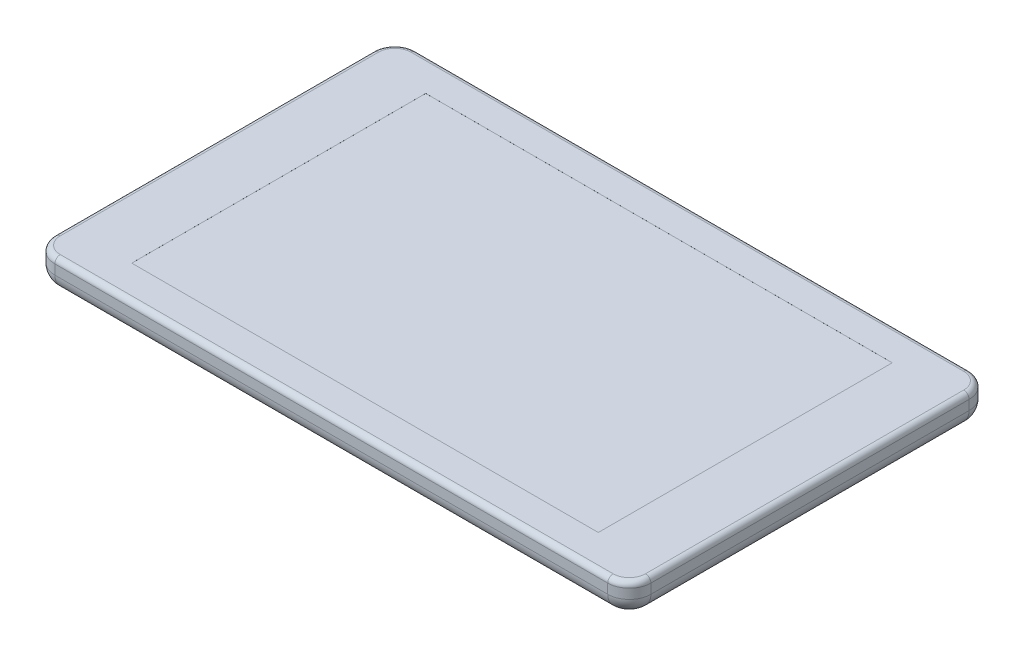
ISO-10303-21;
HEADER;
FILE_DESCRIPTION(('STEP AP214'),'2;1');
FILE_NAME('part.step','',(''),(''),'','','');
FILE_SCHEMA(('AUTOMOTIVE_DESIGN { 1 0 10303 214 1 1 1 1 }'));
ENDSEC;
DATA;
#1=APPLICATION_CONTEXT('core data for automotive mechanical design processes');
#2=APPLICATION_PROTOCOL_DEFINITION('international standard','automotive_design',2000,#1);
#3=PRODUCT_CONTEXT('',#1,'mechanical');
#4=PRODUCT('Part','Part','',(#3));
#5=PRODUCT_RELATED_PRODUCT_CATEGORY('part','',(#4));
#6=PRODUCT_DEFINITION_FORMATION('','',#4);
#7=PRODUCT_DEFINITION_CONTEXT('part definition',#1,'design');
#8=PRODUCT_DEFINITION('design','',#6,#7);
#9=PRODUCT_DEFINITION_SHAPE('','',#8);
#10=(LENGTH_UNIT() NAMED_UNIT(*) SI_UNIT(.MILLI.,.METRE.));
#11=(NAMED_UNIT(*) PLANE_ANGLE_UNIT() SI_UNIT($,.RADIAN.));
#12=(NAMED_UNIT(*) SI_UNIT($,.STERADIAN.) SOLID_ANGLE_UNIT());
#13=UNCERTAINTY_MEASURE_WITH_UNIT(LENGTH_MEASURE(1.E-05),#10,'distance_accuracy_value','');
#14=(GEOMETRIC_REPRESENTATION_CONTEXT(3) GLOBAL_UNCERTAINTY_ASSIGNED_CONTEXT((#13)) GLOBAL_UNIT_ASSIGNED_CONTEXT((#10,
#11,#12)) REPRESENTATION_CONTEXT('',''));
#15=CARTESIAN_POINT('',(0.,0.,0.));
#16=DIRECTION('',(0.,0.,1.));
#17=DIRECTION('',(1.,0.,0.));
#18=AXIS2_PLACEMENT_3D('',#15,#16,#17);
#19=CARTESIAN_POINT('',(-110.5,11.6,67.));
#20=DIRECTION('',(1.,0.,0.));
#21=DIRECTION('',(0.,0.,-1.));
#22=AXIS2_PLACEMENT_3D('',#19,#20,#21);
#23=PLANE('',#22);
#24=DIRECTION('',(0.,-1.,0.));
#25=VECTOR('',#24,1.);
#26=CARTESIAN_POINT('',(-110.5,11.6,-59.));
#27=LINE('',#26,#25);
#28=CARTESIAN_POINT('',(-110.5,9.6,-59.));
#29=VERTEX_POINT('',#28);
#30=CARTESIAN_POINT('',(-110.5,6.,-59.));
#31=VERTEX_POINT('',#30);
#32=EDGE_CURVE('E216',#29,#31,#27,.T.);
#33=ORIENTED_EDGE('',*,*,#32,.T.);
#34=DIRECTION('',(0.,0.,1.));
#35=VECTOR('',#34,1.);
#36=CARTESIAN_POINT('',(-110.5,6.,67.));
#37=LINE('',#36,#35);
#38=CARTESIAN_POINT('',(-110.5,6.,59.));
#39=VERTEX_POINT('',#38);
#40=EDGE_CURVE('E12',#31,#39,#37,.T.);
#41=ORIENTED_EDGE('',*,*,#40,.T.);
#42=DIRECTION('',(0.,-1.,0.));
#43=VECTOR('',#42,1.);
#44=CARTESIAN_POINT('',(-110.5,11.6,59.));
#45=LINE('',#44,#43);
#46=CARTESIAN_POINT('',(-110.5,9.6,59.));
#47=VERTEX_POINT('',#46);
#48=EDGE_CURVE('E214',#39,#47,#45,.F.);
#49=ORIENTED_EDGE('',*,*,#48,.T.);
#50=DIRECTION('',(0.,0.,1.));
#51=VECTOR('',#50,1.);
#52=CARTESIAN_POINT('',(-110.5,9.6,-59.));
#53=LINE('',#52,#51);
#54=EDGE_CURVE('E264',#47,#29,#53,.F.);
#55=ORIENTED_EDGE('',*,*,#54,.T.);
#56=EDGE_LOOP('',(#33,#41,#49,#55));
#57=FACE_BOUND('',#56,.T.);
#58=ADVANCED_FACE('F36',(#57),#23,.F.);
#59=CARTESIAN_POINT('',(110.5,11.6,67.));
#60=DIRECTION('',(0.,0.,-1.));
#61=DIRECTION('',(-1.,0.,0.));
#62=AXIS2_PLACEMENT_3D('',#59,#60,#61);
#63=PLANE('',#62);
#64=DIRECTION('',(0.,-1.,0.));
#65=VECTOR('',#64,1.);
#66=CARTESIAN_POINT('',(-102.5,11.6,67.));
#67=LINE('',#66,#65);
#68=CARTESIAN_POINT('',(-102.5,9.6,67.));
#69=VERTEX_POINT('',#68);
#70=CARTESIAN_POINT('',(-102.5,6.,67.));
#71=VERTEX_POINT('',#70);
#72=EDGE_CURVE('E229',#69,#71,#67,.T.);
#73=ORIENTED_EDGE('',*,*,#72,.T.);
#74=DIRECTION('',(1.,0.,0.));
#75=VECTOR('',#74,1.);
#76=CARTESIAN_POINT('',(110.5,6.,67.));
#77=LINE('',#76,#75);
#78=CARTESIAN_POINT('',(102.5,6.,67.));
#79=VERTEX_POINT('',#78);
#80=EDGE_CURVE('E313',#71,#79,#77,.T.);
#81=ORIENTED_EDGE('',*,*,#80,.T.);
#82=DIRECTION('',(0.,-1.,0.));
#83=VECTOR('',#82,1.);
#84=CARTESIAN_POINT('',(102.5,11.6,67.));
#85=LINE('',#84,#83);
#86=CARTESIAN_POINT('',(102.5,9.6,67.));
#87=VERTEX_POINT('',#86);
#88=EDGE_CURVE('E232',#79,#87,#85,.F.);
#89=ORIENTED_EDGE('',*,*,#88,.T.);
#90=DIRECTION('',(1.,0.,0.));
#91=VECTOR('',#90,1.);
#92=CARTESIAN_POINT('',(-102.5,9.6,67.));
#93=LINE('',#92,#91);
#94=EDGE_CURVE('E259',#87,#69,#93,.F.);
#95=ORIENTED_EDGE('',*,*,#94,.T.);
#96=EDGE_LOOP('',(#73,#81,#89,#95));
#97=FACE_BOUND('',#96,.T.);
#98=ADVANCED_FACE('F395',(#97),#63,.F.);
#99=CARTESIAN_POINT('',(110.5,11.6,67.));
#100=DIRECTION('',(-1.,0.,0.));
#101=DIRECTION('',(0.,0.,1.));
#102=AXIS2_PLACEMENT_3D('',#99,#100,#101);
#103=PLANE('',#102);
#104=DIRECTION('',(0.,-1.,0.));
#105=VECTOR('',#104,1.);
#106=CARTESIAN_POINT('',(110.5,11.6,59.));
#107=LINE('',#106,#105);
#108=CARTESIAN_POINT('',(110.5,9.6,59.));
#109=VERTEX_POINT('',#108);
#110=CARTESIAN_POINT('',(110.5,6.,59.));
#111=VERTEX_POINT('',#110);
#112=EDGE_CURVE('E224',#109,#111,#107,.T.);
#113=ORIENTED_EDGE('',*,*,#112,.T.);
#114=DIRECTION('',(0.,0.,-1.));
#115=VECTOR('',#114,1.);
#116=CARTESIAN_POINT('',(110.5,6.,67.));
#117=LINE('',#116,#115);
#118=CARTESIAN_POINT('',(110.5,6.,-59.));
#119=VERTEX_POINT('',#118);
#120=EDGE_CURVE('E317',#111,#119,#117,.T.);
#121=ORIENTED_EDGE('',*,*,#120,.T.);
#122=DIRECTION('',(0.,-1.,0.));
#123=VECTOR('',#122,1.);
#124=CARTESIAN_POINT('',(110.5,11.6,-59.));
#125=LINE('',#124,#123);
#126=CARTESIAN_POINT('',(110.5,9.6,-59.));
#127=VERTEX_POINT('',#126);
#128=EDGE_CURVE('E227',#119,#127,#125,.F.);
#129=ORIENTED_EDGE('',*,*,#128,.T.);
#130=DIRECTION('',(0.,0.,-1.));
#131=VECTOR('',#130,1.);
#132=CARTESIAN_POINT('',(110.5,9.6,59.));
#133=LINE('',#132,#131);
#134=EDGE_CURVE('E254',#127,#109,#133,.F.);
#135=ORIENTED_EDGE('',*,*,#134,.T.);
#136=EDGE_LOOP('',(#113,#121,#129,#135));
#137=FACE_BOUND('',#136,.T.);
#138=ADVANCED_FACE('F378',(#137),#103,.F.);
#139=CARTESIAN_POINT('',(110.5,11.6,-67.));
#140=DIRECTION('',(0.,0.,1.));
#141=DIRECTION('',(1.,0.,0.));
#142=AXIS2_PLACEMENT_3D('',#139,#140,#141);
#143=PLANE('',#142);
#144=DIRECTION('',(0.,-1.,0.));
#145=VECTOR('',#144,1.);
#146=CARTESIAN_POINT('',(102.5,11.6,-67.));
#147=LINE('',#146,#145);
#148=CARTESIAN_POINT('',(102.5,9.6,-67.));
#149=VERTEX_POINT('',#148);
#150=CARTESIAN_POINT('',(102.5,6.,-67.));
#151=VERTEX_POINT('',#150);
#152=EDGE_CURVE('E219',#149,#151,#147,.T.);
#153=ORIENTED_EDGE('',*,*,#152,.T.);
#154=DIRECTION('',(-1.,0.,0.));
#155=VECTOR('',#154,1.);
#156=CARTESIAN_POINT('',(110.5,6.,-67.));
#157=LINE('',#156,#155);
#158=CARTESIAN_POINT('',(-102.5,6.,-67.));
#159=VERTEX_POINT('',#158);
#160=EDGE_CURVE('E321',#151,#159,#157,.T.);
#161=ORIENTED_EDGE('',*,*,#160,.T.);
#162=DIRECTION('',(0.,-1.,0.));
#163=VECTOR('',#162,1.);
#164=CARTESIAN_POINT('',(-102.5,11.6,-67.));
#165=LINE('',#164,#163);
#166=CARTESIAN_POINT('',(-102.5,9.6,-67.));
#167=VERTEX_POINT('',#166);
#168=EDGE_CURVE('E222',#159,#167,#165,.F.);
#169=ORIENTED_EDGE('',*,*,#168,.T.);
#170=DIRECTION('',(-1.,0.,0.));
#171=VECTOR('',#170,1.);
#172=CARTESIAN_POINT('',(102.5,9.6,-67.));
#173=LINE('',#172,#171);
#174=EDGE_CURVE('E269',#167,#149,#173,.F.);
#175=ORIENTED_EDGE('',*,*,#174,.T.);
#176=EDGE_LOOP('',(#153,#161,#169,#175));
#177=FACE_BOUND('',#176,.T.);
#178=ADVANCED_FACE('F360',(#177),#143,.F.);
#179=CARTESIAN_POINT('',(0.,11.6,0.));
#180=DIRECTION('',(0.,1.,0.));
#181=DIRECTION('',(0.,0.,1.));
#182=AXIS2_PLACEMENT_3D('',#179,#180,#181);
#183=PLANE('',#182);
#184=DIRECTION('',(0.,0.,1.));
#185=VECTOR('',#184,1.);
#186=CARTESIAN_POINT('',(-86.5,11.6,54.5));
#187=LINE('',#186,#185);
#188=CARTESIAN_POINT('',(-86.5,11.6,-54.5));
#189=VERTEX_POINT('',#188);
#190=CARTESIAN_POINT('',(-86.5,11.6,54.5));
#191=VERTEX_POINT('',#190);
#192=EDGE_CURVE('E53',#189,#191,#187,.T.);
#193=ORIENTED_EDGE('',*,*,#192,.F.);
#194=DIRECTION('',(-1.,0.,0.));
#195=VECTOR('',#194,1.);
#196=CARTESIAN_POINT('',(86.5,11.6,-54.5));
#197=LINE('',#196,#195);
#198=CARTESIAN_POINT('',(86.5,11.6,-54.5));
#199=VERTEX_POINT('',#198);
#200=EDGE_CURVE('E195',#199,#189,#197,.T.);
#201=ORIENTED_EDGE('',*,*,#200,.F.);
#202=DIRECTION('',(0.,0.,-1.));
#203=VECTOR('',#202,1.);
#204=CARTESIAN_POINT('',(86.5,11.6,54.5));
#205=LINE('',#204,#203);
#206=CARTESIAN_POINT('',(86.5,11.6,54.5));
#207=VERTEX_POINT('',#206);
#208=EDGE_CURVE('E198',#207,#199,#205,.T.);
#209=ORIENTED_EDGE('',*,*,#208,.F.);
#210=DIRECTION('',(1.,0.,0.));
#211=VECTOR('',#210,1.);
#212=CARTESIAN_POINT('',(86.5,11.6,54.5));
#213=LINE('',#212,#211);
#214=EDGE_CURVE('E204',#191,#207,#213,.T.);
#215=ORIENTED_EDGE('',*,*,#214,.F.);
#216=EDGE_LOOP('',(#193,#201,#209,#215));
#217=FACE_BOUND('',#216,.T.);
#218=DIRECTION('',(0.,0.,-1.));
#219=VECTOR('',#218,1.);
#220=CARTESIAN_POINT('',(108.5,11.6,-59.));
#221=LINE('',#220,#219);
#222=CARTESIAN_POINT('',(108.5,11.6,59.));
#223=VERTEX_POINT('',#222);
#224=CARTESIAN_POINT('',(108.5,11.6,-59.));
#225=VERTEX_POINT('',#224);
#226=EDGE_CURVE('E246',#223,#225,#221,.T.);
#227=ORIENTED_EDGE('',*,*,#226,.T.);
#228=CARTESIAN_POINT('',(102.5,11.6,-59.));
#229=DIRECTION('',(0.,1.,0.));
#230=DIRECTION('',(0.,0.,1.));
#231=AXIS2_PLACEMENT_3D('',#228,#229,#230);
#232=CIRCLE('',#231,6.);
#233=CARTESIAN_POINT('',(102.5,11.6,-65.));
#234=VERTEX_POINT('',#233);
#235=EDGE_CURVE('E248',#225,#234,#232,.T.);
#236=ORIENTED_EDGE('',*,*,#235,.T.);
#237=DIRECTION('',(-1.,0.,0.));
#238=VECTOR('',#237,1.);
#239=CARTESIAN_POINT('',(-102.5,11.6,-65.));
#240=LINE('',#239,#238);
#241=CARTESIAN_POINT('',(-102.5,11.6,-65.));
#242=VERTEX_POINT('',#241);
#243=EDGE_CURVE('E234',#234,#242,#240,.T.);
#244=ORIENTED_EDGE('',*,*,#243,.T.);
#245=CARTESIAN_POINT('',(-102.5,11.6,-59.));
#246=DIRECTION('',(0.,1.,0.));
#247=DIRECTION('',(0.,0.,1.));
#248=AXIS2_PLACEMENT_3D('',#245,#246,#247);
#249=CIRCLE('',#248,6.);
#250=CARTESIAN_POINT('',(-108.5,11.6,-59.));
#251=VERTEX_POINT('',#250);
#252=EDGE_CURVE('E236',#242,#251,#249,.T.);
#253=ORIENTED_EDGE('',*,*,#252,.T.);
#254=DIRECTION('',(0.,0.,1.));
#255=VECTOR('',#254,1.);
#256=CARTESIAN_POINT('',(-108.5,11.6,59.));
#257=LINE('',#256,#255);
#258=CARTESIAN_POINT('',(-108.5,11.6,59.));
#259=VERTEX_POINT('',#258);
#260=EDGE_CURVE('E238',#251,#259,#257,.T.);
#261=ORIENTED_EDGE('',*,*,#260,.T.);
#262=CARTESIAN_POINT('',(-102.5,11.6,59.));
#263=DIRECTION('',(0.,1.,0.));
#264=DIRECTION('',(0.,0.,1.));
#265=AXIS2_PLACEMENT_3D('',#262,#263,#264);
#266=CIRCLE('',#265,6.);
#267=CARTESIAN_POINT('',(-102.5,11.6,65.));
#268=VERTEX_POINT('',#267);
#269=EDGE_CURVE('E240',#259,#268,#266,.T.);
#270=ORIENTED_EDGE('',*,*,#269,.T.);
#271=DIRECTION('',(1.,0.,0.));
#272=VECTOR('',#271,1.);
#273=CARTESIAN_POINT('',(102.5,11.6,65.));
#274=LINE('',#273,#272);
#275=CARTESIAN_POINT('',(102.5,11.6,65.));
#276=VERTEX_POINT('',#275);
#277=EDGE_CURVE('E242',#268,#276,#274,.T.);
#278=ORIENTED_EDGE('',*,*,#277,.T.);
#279=CARTESIAN_POINT('',(102.5,11.6,59.));
#280=DIRECTION('',(0.,1.,0.));
#281=DIRECTION('',(0.,0.,1.));
#282=AXIS2_PLACEMENT_3D('',#279,#280,#281);
#283=CIRCLE('',#282,6.);
#284=EDGE_CURVE('E244',#276,#223,#283,.T.);
#285=ORIENTED_EDGE('',*,*,#284,.T.);
#286=EDGE_LOOP('',(#227,#236,#244,#253,#261,#270,#278,#285));
#287=FACE_BOUND('',#286,.T.);
#288=ADVANCED_FACE('F419',(#217,#287),#183,.T.);
#289=CARTESIAN_POINT('',(0.,0.,0.));
#290=DIRECTION('',(0.,1.,0.));
#291=DIRECTION('',(0.,0.,1.));
#292=AXIS2_PLACEMENT_3D('',#289,#290,#291);
#293=PLANE('',#292);
#294=DIRECTION('',(1.,0.,0.));
#295=VECTOR('',#294,1.);
#296=CARTESIAN_POINT('',(0.,0.,61.));
#297=LINE('',#296,#295);
#298=CARTESIAN_POINT('',(102.5,0.,61.));
#299=VERTEX_POINT('',#298);
#300=CARTESIAN_POINT('',(-102.5,0.,61.));
#301=VERTEX_POINT('',#300);
#302=EDGE_CURVE('E305',#299,#301,#297,.F.);
#303=ORIENTED_EDGE('',*,*,#302,.T.);
#304=CARTESIAN_POINT('',(-102.5,0.,59.));
#305=DIRECTION('',(0.,1.,0.));
#306=DIRECTION('',(0.,0.,1.));
#307=AXIS2_PLACEMENT_3D('',#304,#305,#306);
#308=CIRCLE('',#307,2.);
#309=CARTESIAN_POINT('',(-104.5,0.,59.));
#310=VERTEX_POINT('',#309);
#311=EDGE_CURVE('E307',#301,#310,#308,.F.);
#312=ORIENTED_EDGE('',*,*,#311,.T.);
#313=DIRECTION('',(0.,0.,1.));
#314=VECTOR('',#313,1.);
#315=CARTESIAN_POINT('',(-104.5,0.,0.));
#316=LINE('',#315,#314);
#317=CARTESIAN_POINT('',(-104.5,0.,-59.));
#318=VERTEX_POINT('',#317);
#319=EDGE_CURVE('E271',#310,#318,#316,.F.);
#320=ORIENTED_EDGE('',*,*,#319,.T.);
#321=CARTESIAN_POINT('',(-102.5,0.,-59.));
#322=DIRECTION('',(0.,1.,0.));
#323=DIRECTION('',(0.,0.,1.));
#324=AXIS2_PLACEMENT_3D('',#321,#322,#323);
#325=CIRCLE('',#324,2.);
#326=CARTESIAN_POINT('',(-102.5,0.,-61.));
#327=VERTEX_POINT('',#326);
#328=EDGE_CURVE('E295',#318,#327,#325,.F.);
#329=ORIENTED_EDGE('',*,*,#328,.T.);
#330=DIRECTION('',(-1.,0.,0.));
#331=VECTOR('',#330,1.);
#332=CARTESIAN_POINT('',(0.,0.,-61.));
#333=LINE('',#332,#331);
#334=CARTESIAN_POINT('',(102.5,0.,-61.));
#335=VERTEX_POINT('',#334);
#336=EDGE_CURVE('E297',#327,#335,#333,.F.);
#337=ORIENTED_EDGE('',*,*,#336,.T.);
#338=CARTESIAN_POINT('',(102.5,0.,-59.));
#339=DIRECTION('',(0.,1.,0.));
#340=DIRECTION('',(0.,0.,1.));
#341=AXIS2_PLACEMENT_3D('',#338,#339,#340);
#342=CIRCLE('',#341,2.);
#343=CARTESIAN_POINT('',(104.5,0.,-59.));
#344=VERTEX_POINT('',#343);
#345=EDGE_CURVE('E299',#335,#344,#342,.F.);
#346=ORIENTED_EDGE('',*,*,#345,.T.);
#347=DIRECTION('',(0.,0.,-1.));
#348=VECTOR('',#347,1.);
#349=CARTESIAN_POINT('',(104.5,0.,0.));
#350=LINE('',#349,#348);
#351=CARTESIAN_POINT('',(104.5,0.,59.));
#352=VERTEX_POINT('',#351);
#353=EDGE_CURVE('E301',#344,#352,#350,.F.);
#354=ORIENTED_EDGE('',*,*,#353,.T.);
#355=CARTESIAN_POINT('',(102.5,0.,59.));
#356=DIRECTION('',(0.,1.,0.));
#357=DIRECTION('',(0.,0.,1.));
#358=AXIS2_PLACEMENT_3D('',#355,#356,#357);
#359=CIRCLE('',#358,2.);
#360=EDGE_CURVE('E303',#352,#299,#359,.F.);
#361=ORIENTED_EDGE('',*,*,#360,.T.);
#362=EDGE_LOOP('',(#303,#312,#320,#329,#337,#346,#354,#361));
#363=FACE_BOUND('',#362,.T.);
#364=ADVANCED_FACE('F421',(#363),#293,.F.);
#365=CARTESIAN_POINT('',(-102.5,11.6,-59.));
#366=DIRECTION('',(0.,-1.,0.));
#367=DIRECTION('',(0.,0.,-1.));
#368=AXIS2_PLACEMENT_3D('',#365,#366,#367);
#369=CYLINDRICAL_SURFACE('',#368,8.);
#370=ORIENTED_EDGE('',*,*,#168,.F.);
#371=CARTESIAN_POINT('',(-102.5,6.,-59.));
#372=DIRECTION('',(0.,1.,0.));
#373=DIRECTION('',(0.,0.,1.));
#374=AXIS2_PLACEMENT_3D('',#371,#372,#373);
#375=CIRCLE('',#374,8.);
#376=EDGE_CURVE('E45',#159,#31,#375,.T.);
#377=ORIENTED_EDGE('',*,*,#376,.T.);
#378=ORIENTED_EDGE('',*,*,#32,.F.);
#379=CARTESIAN_POINT('',(-102.5,9.6,-59.));
#380=DIRECTION('',(0.,1.,0.));
#381=DIRECTION('',(0.,0.,1.));
#382=AXIS2_PLACEMENT_3D('',#379,#380,#381);
#383=CIRCLE('',#382,8.);
#384=EDGE_CURVE('E266',#29,#167,#383,.F.);
#385=ORIENTED_EDGE('',*,*,#384,.T.);
#386=EDGE_LOOP('',(#370,#377,#378,#385));
#387=FACE_BOUND('',#386,.T.);
#388=ADVANCED_FACE('F413',(#387),#369,.T.);
#389=CARTESIAN_POINT('',(102.5,11.6,-59.));
#390=DIRECTION('',(0.,-1.,0.));
#391=DIRECTION('',(0.,0.,-1.));
#392=AXIS2_PLACEMENT_3D('',#389,#390,#391);
#393=CYLINDRICAL_SURFACE('',#392,8.);
#394=ORIENTED_EDGE('',*,*,#128,.F.);
#395=CARTESIAN_POINT('',(102.5,6.,-59.));
#396=DIRECTION('',(0.,1.,0.));
#397=DIRECTION('',(0.,0.,1.));
#398=AXIS2_PLACEMENT_3D('',#395,#396,#397);
#399=CIRCLE('',#398,8.);
#400=EDGE_CURVE('E319',#119,#151,#399,.T.);
#401=ORIENTED_EDGE('',*,*,#400,.T.);
#402=ORIENTED_EDGE('',*,*,#152,.F.);
#403=CARTESIAN_POINT('',(102.5,9.6,-59.));
#404=DIRECTION('',(0.,1.,0.));
#405=DIRECTION('',(0.,0.,1.));
#406=AXIS2_PLACEMENT_3D('',#403,#404,#405);
#407=CIRCLE('',#406,8.);
#408=EDGE_CURVE('E251',#149,#127,#407,.F.);
#409=ORIENTED_EDGE('',*,*,#408,.T.);
#410=EDGE_LOOP('',(#394,#401,#402,#409));
#411=FACE_BOUND('',#410,.T.);
#412=ADVANCED_FACE('F357',(#411),#393,.T.);
#413=CARTESIAN_POINT('',(102.5,11.6,59.));
#414=DIRECTION('',(0.,-1.,0.));
#415=DIRECTION('',(0.,0.,-1.));
#416=AXIS2_PLACEMENT_3D('',#413,#414,#415);
#417=CYLINDRICAL_SURFACE('',#416,8.);
#418=ORIENTED_EDGE('',*,*,#88,.F.);
#419=CARTESIAN_POINT('',(102.5,6.,59.));
#420=DIRECTION('',(0.,1.,0.));
#421=DIRECTION('',(0.,0.,1.));
#422=AXIS2_PLACEMENT_3D('',#419,#420,#421);
#423=CIRCLE('',#422,8.);
#424=EDGE_CURVE('E315',#79,#111,#423,.T.);
#425=ORIENTED_EDGE('',*,*,#424,.T.);
#426=ORIENTED_EDGE('',*,*,#112,.F.);
#427=CARTESIAN_POINT('',(102.5,9.6,59.));
#428=DIRECTION('',(0.,1.,0.));
#429=DIRECTION('',(0.,0.,1.));
#430=AXIS2_PLACEMENT_3D('',#427,#428,#429);
#431=CIRCLE('',#430,8.);
#432=EDGE_CURVE('E256',#109,#87,#431,.F.);
#433=ORIENTED_EDGE('',*,*,#432,.T.);
#434=EDGE_LOOP('',(#418,#425,#426,#433));
#435=FACE_BOUND('',#434,.T.);
#436=ADVANCED_FACE('F382',(#435),#417,.T.);
#437=CARTESIAN_POINT('',(-102.5,11.6,59.));
#438=DIRECTION('',(0.,-1.,0.));
#439=DIRECTION('',(0.,0.,-1.));
#440=AXIS2_PLACEMENT_3D('',#437,#438,#439);
#441=CYLINDRICAL_SURFACE('',#440,8.);
#442=ORIENTED_EDGE('',*,*,#48,.F.);
#443=CARTESIAN_POINT('',(-102.5,6.,59.));
#444=DIRECTION('',(0.,1.,0.));
#445=DIRECTION('',(0.,0.,1.));
#446=AXIS2_PLACEMENT_3D('',#443,#444,#445);
#447=CIRCLE('',#446,8.);
#448=EDGE_CURVE('E310',#39,#71,#447,.T.);
#449=ORIENTED_EDGE('',*,*,#448,.T.);
#450=ORIENTED_EDGE('',*,*,#72,.F.);
#451=CARTESIAN_POINT('',(-102.5,9.6,59.));
#452=DIRECTION('',(0.,1.,0.));
#453=DIRECTION('',(0.,0.,1.));
#454=AXIS2_PLACEMENT_3D('',#451,#452,#453);
#455=CIRCLE('',#454,8.);
#456=EDGE_CURVE('E261',#69,#47,#455,.F.);
#457=ORIENTED_EDGE('',*,*,#456,.T.);
#458=EDGE_LOOP('',(#442,#449,#450,#457));
#459=FACE_BOUND('',#458,.T.);
#460=ADVANCED_FACE('F399',(#459),#441,.T.);
#461=CARTESIAN_POINT('',(-102.5,9.6,59.));
#462=DIRECTION('',(0.,1.,0.));
#463=DIRECTION('',(0.,0.,1.));
#464=AXIS2_PLACEMENT_3D('',#461,#462,#463);
#465=TOROIDAL_SURFACE('',#464,6.,2.);
#466=CARTESIAN_POINT('',(-108.5,9.6,59.));
#467=DIRECTION('',(0.,0.,-1.));
#468=DIRECTION('',(-1.,0.,0.));
#469=AXIS2_PLACEMENT_3D('',#466,#467,#468);
#470=CIRCLE('',#469,2.);
#471=EDGE_CURVE('E289',#47,#259,#470,.T.);
#472=ORIENTED_EDGE('',*,*,#471,.F.);
#473=ORIENTED_EDGE('',*,*,#456,.F.);
#474=CARTESIAN_POINT('',(-102.5,9.6,65.));
#475=DIRECTION('',(1.,0.,0.));
#476=DIRECTION('',(0.,0.,-1.));
#477=AXIS2_PLACEMENT_3D('',#474,#475,#476);
#478=CIRCLE('',#477,2.);
#479=EDGE_CURVE('E217',#268,#69,#478,.T.);
#480=ORIENTED_EDGE('',*,*,#479,.F.);
#481=ORIENTED_EDGE('',*,*,#269,.F.);
#482=EDGE_LOOP('',(#472,#473,#480,#481));
#483=FACE_BOUND('',#482,.T.);
#484=ADVANCED_FACE('F403',(#483),#465,.T.);
#485=CARTESIAN_POINT('',(0.,9.6,65.));
#486=DIRECTION('',(-1.,0.,0.));
#487=DIRECTION('',(0.,0.,1.));
#488=AXIS2_PLACEMENT_3D('',#485,#486,#487);
#489=CYLINDRICAL_SURFACE('',#488,2.);
#490=ORIENTED_EDGE('',*,*,#479,.T.);
#491=ORIENTED_EDGE('',*,*,#94,.F.);
#492=CARTESIAN_POINT('',(102.5,9.6,65.));
#493=DIRECTION('',(1.,0.,0.));
#494=DIRECTION('',(0.,0.,-1.));
#495=AXIS2_PLACEMENT_3D('',#492,#493,#494);
#496=CIRCLE('',#495,2.);
#497=EDGE_CURVE('E286',#276,#87,#496,.T.);
#498=ORIENTED_EDGE('',*,*,#497,.F.);
#499=ORIENTED_EDGE('',*,*,#277,.F.);
#500=EDGE_LOOP('',(#490,#491,#498,#499));
#501=FACE_BOUND('',#500,.T.);
#502=ADVANCED_FACE('F391',(#501),#489,.T.);
#503=CARTESIAN_POINT('',(-108.5,9.6,0.));
#504=DIRECTION('',(0.,0.,-1.));
#505=DIRECTION('',(-1.,0.,0.));
#506=AXIS2_PLACEMENT_3D('',#503,#504,#505);
#507=CYLINDRICAL_SURFACE('',#506,2.);
#508=ORIENTED_EDGE('',*,*,#471,.T.);
#509=ORIENTED_EDGE('',*,*,#260,.F.);
#510=CARTESIAN_POINT('',(-108.5,9.6,-59.));
#511=DIRECTION('',(0.,0.,-1.));
#512=DIRECTION('',(-1.,0.,0.));
#513=AXIS2_PLACEMENT_3D('',#510,#511,#512);
#514=CIRCLE('',#513,2.);
#515=EDGE_CURVE('E283',#29,#251,#514,.T.);
#516=ORIENTED_EDGE('',*,*,#515,.F.);
#517=ORIENTED_EDGE('',*,*,#54,.F.);
#518=EDGE_LOOP('',(#508,#509,#516,#517));
#519=FACE_BOUND('',#518,.T.);
#520=ADVANCED_FACE('F409',(#519),#507,.T.);
#521=CARTESIAN_POINT('',(102.5,9.6,59.));
#522=DIRECTION('',(0.,1.,0.));
#523=DIRECTION('',(0.,0.,1.));
#524=AXIS2_PLACEMENT_3D('',#521,#522,#523);
#525=TOROIDAL_SURFACE('',#524,6.,2.);
#526=ORIENTED_EDGE('',*,*,#497,.T.);
#527=ORIENTED_EDGE('',*,*,#432,.F.);
#528=CARTESIAN_POINT('',(108.5,9.6,59.));
#529=DIRECTION('',(0.,0.,-1.));
#530=DIRECTION('',(-1.,0.,0.));
#531=AXIS2_PLACEMENT_3D('',#528,#529,#530);
#532=CIRCLE('',#531,2.);
#533=EDGE_CURVE('E280',#223,#109,#532,.T.);
#534=ORIENTED_EDGE('',*,*,#533,.F.);
#535=ORIENTED_EDGE('',*,*,#284,.F.);
#536=EDGE_LOOP('',(#526,#527,#534,#535));
#537=FACE_BOUND('',#536,.T.);
#538=ADVANCED_FACE('F386',(#537),#525,.T.);
#539=CARTESIAN_POINT('',(-102.5,9.6,-59.));
#540=DIRECTION('',(0.,1.,0.));
#541=DIRECTION('',(0.,0.,1.));
#542=AXIS2_PLACEMENT_3D('',#539,#540,#541);
#543=TOROIDAL_SURFACE('',#542,6.,2.);
#544=ORIENTED_EDGE('',*,*,#515,.T.);
#545=ORIENTED_EDGE('',*,*,#252,.F.);
#546=CARTESIAN_POINT('',(-102.5,9.6,-65.));
#547=DIRECTION('',(1.,0.,0.));
#548=DIRECTION('',(0.,0.,-1.));
#549=AXIS2_PLACEMENT_3D('',#546,#547,#548);
#550=CIRCLE('',#549,2.);
#551=EDGE_CURVE('E277',#167,#242,#550,.T.);
#552=ORIENTED_EDGE('',*,*,#551,.F.);
#553=ORIENTED_EDGE('',*,*,#384,.F.);
#554=EDGE_LOOP('',(#544,#545,#552,#553));
#555=FACE_BOUND('',#554,.T.);
#556=ADVANCED_FACE('F417',(#555),#543,.T.);
#557=CARTESIAN_POINT('',(108.5,9.6,0.));
#558=DIRECTION('',(0.,0.,1.));
#559=DIRECTION('',(1.,0.,0.));
#560=AXIS2_PLACEMENT_3D('',#557,#558,#559);
#561=CYLINDRICAL_SURFACE('',#560,2.);
#562=ORIENTED_EDGE('',*,*,#533,.T.);
#563=ORIENTED_EDGE('',*,*,#134,.F.);
#564=CARTESIAN_POINT('',(108.5,9.6,-59.));
#565=DIRECTION('',(0.,0.,-1.));
#566=DIRECTION('',(-1.,0.,0.));
#567=AXIS2_PLACEMENT_3D('',#564,#565,#566);
#568=CIRCLE('',#567,2.);
#569=EDGE_CURVE('E274',#225,#127,#568,.T.);
#570=ORIENTED_EDGE('',*,*,#569,.F.);
#571=ORIENTED_EDGE('',*,*,#226,.F.);
#572=EDGE_LOOP('',(#562,#563,#570,#571));
#573=FACE_BOUND('',#572,.T.);
#574=ADVANCED_FACE('F374',(#573),#561,.T.);
#575=CARTESIAN_POINT('',(0.,9.6,-65.));
#576=DIRECTION('',(1.,0.,0.));
#577=DIRECTION('',(0.,0.,-1.));
#578=AXIS2_PLACEMENT_3D('',#575,#576,#577);
#579=CYLINDRICAL_SURFACE('',#578,2.);
#580=ORIENTED_EDGE('',*,*,#551,.T.);
#581=ORIENTED_EDGE('',*,*,#243,.F.);
#582=CARTESIAN_POINT('',(102.5,9.6,-65.));
#583=DIRECTION('',(1.,0.,0.));
#584=DIRECTION('',(0.,0.,-1.));
#585=AXIS2_PLACEMENT_3D('',#582,#583,#584);
#586=CIRCLE('',#585,2.);
#587=EDGE_CURVE('E272',#149,#234,#586,.T.);
#588=ORIENTED_EDGE('',*,*,#587,.F.);
#589=ORIENTED_EDGE('',*,*,#174,.F.);
#590=EDGE_LOOP('',(#580,#581,#588,#589));
#591=FACE_BOUND('',#590,.T.);
#592=ADVANCED_FACE('F364',(#591),#579,.T.);
#593=CARTESIAN_POINT('',(102.5,9.6,-59.));
#594=DIRECTION('',(0.,1.,0.));
#595=DIRECTION('',(0.,0.,1.));
#596=AXIS2_PLACEMENT_3D('',#593,#594,#595);
#597=TOROIDAL_SURFACE('',#596,6.,2.);
#598=ORIENTED_EDGE('',*,*,#569,.T.);
#599=ORIENTED_EDGE('',*,*,#408,.F.);
#600=ORIENTED_EDGE('',*,*,#587,.T.);
#601=ORIENTED_EDGE('',*,*,#235,.F.);
#602=EDGE_LOOP('',(#598,#599,#600,#601));
#603=FACE_BOUND('',#602,.T.);
#604=ADVANCED_FACE('F369',(#603),#597,.T.);
#605=CARTESIAN_POINT('',(102.5,6.,-59.));
#606=DIRECTION('',(0.,1.,0.));
#607=DIRECTION('',(0.,0.,1.));
#608=AXIS2_PLACEMENT_3D('',#605,#606,#607);
#609=DEGENERATE_TOROIDAL_SURFACE('',#608,2.,6.,.T.);
#610=CARTESIAN_POINT('',(102.5,6.,-61.));
#611=DIRECTION('',(-1.,0.,0.));
#612=DIRECTION('',(0.,0.,1.));
#613=AXIS2_PLACEMENT_3D('',#610,#611,#612);
#614=CIRCLE('',#613,6.);
#615=EDGE_CURVE('E338',#151,#335,#614,.T.);
#616=ORIENTED_EDGE('',*,*,#615,.F.);
#617=ORIENTED_EDGE('',*,*,#400,.F.);
#618=CARTESIAN_POINT('',(104.5,6.,-59.));
#619=DIRECTION('',(0.,0.,1.));
#620=DIRECTION('',(1.,0.,0.));
#621=AXIS2_PLACEMENT_3D('',#618,#619,#620);
#622=CIRCLE('',#621,6.);
#623=EDGE_CURVE('E40',#344,#119,#622,.T.);
#624=ORIENTED_EDGE('',*,*,#623,.F.);
#625=ORIENTED_EDGE('',*,*,#345,.F.);
#626=EDGE_LOOP('',(#616,#617,#624,#625));
#627=FACE_BOUND('',#626,.T.);
#628=ADVANCED_FACE('F38',(#627),#609,.T.);
#629=CARTESIAN_POINT('',(104.5,6.,67.));
#630=DIRECTION('',(0.,0.,-1.));
#631=DIRECTION('',(-1.,0.,0.));
#632=AXIS2_PLACEMENT_3D('',#629,#630,#631);
#633=CYLINDRICAL_SURFACE('',#632,6.);
#634=ORIENTED_EDGE('',*,*,#623,.T.);
#635=ORIENTED_EDGE('',*,*,#120,.F.);
#636=CARTESIAN_POINT('',(104.5,6.,59.));
#637=DIRECTION('',(0.,0.,1.));
#638=DIRECTION('',(1.,0.,0.));
#639=AXIS2_PLACEMENT_3D('',#636,#637,#638);
#640=CIRCLE('',#639,6.);
#641=EDGE_CURVE('E336',#352,#111,#640,.T.);
#642=ORIENTED_EDGE('',*,*,#641,.F.);
#643=ORIENTED_EDGE('',*,*,#353,.F.);
#644=EDGE_LOOP('',(#634,#635,#642,#643));
#645=FACE_BOUND('',#644,.T.);
#646=ADVANCED_FACE('F349',(#645),#633,.T.);
#647=CARTESIAN_POINT('',(110.5,6.,-61.));
#648=DIRECTION('',(-1.,0.,0.));
#649=DIRECTION('',(0.,0.,1.));
#650=AXIS2_PLACEMENT_3D('',#647,#648,#649);
#651=CYLINDRICAL_SURFACE('',#650,6.);
#652=ORIENTED_EDGE('',*,*,#615,.T.);
#653=ORIENTED_EDGE('',*,*,#336,.F.);
#654=CARTESIAN_POINT('',(-102.5,6.,-61.));
#655=DIRECTION('',(-1.,0.,0.));
#656=DIRECTION('',(0.,0.,1.));
#657=AXIS2_PLACEMENT_3D('',#654,#655,#656);
#658=CIRCLE('',#657,6.);
#659=EDGE_CURVE('E333',#159,#327,#658,.T.);
#660=ORIENTED_EDGE('',*,*,#659,.F.);
#661=ORIENTED_EDGE('',*,*,#160,.F.);
#662=EDGE_LOOP('',(#652,#653,#660,#661));
#663=FACE_BOUND('',#662,.T.);
#664=ADVANCED_FACE('F483',(#663),#651,.T.);
#665=CARTESIAN_POINT('',(102.5,6.,59.));
#666=DIRECTION('',(0.,1.,0.));
#667=DIRECTION('',(0.,0.,1.));
#668=AXIS2_PLACEMENT_3D('',#665,#666,#667);
#669=DEGENERATE_TOROIDAL_SURFACE('',#668,2.,6.,.T.);
#670=ORIENTED_EDGE('',*,*,#641,.T.);
#671=ORIENTED_EDGE('',*,*,#424,.F.);
#672=CARTESIAN_POINT('',(102.5,6.,61.));
#673=DIRECTION('',(-1.,0.,0.));
#674=DIRECTION('',(0.,0.,1.));
#675=AXIS2_PLACEMENT_3D('',#672,#673,#674);
#676=CIRCLE('',#675,6.);
#677=EDGE_CURVE('E330',#299,#79,#676,.T.);
#678=ORIENTED_EDGE('',*,*,#677,.F.);
#679=ORIENTED_EDGE('',*,*,#360,.F.);
#680=EDGE_LOOP('',(#670,#671,#678,#679));
#681=FACE_BOUND('',#680,.T.);
#682=ADVANCED_FACE('F479',(#681),#669,.T.);
#683=CARTESIAN_POINT('',(-102.5,6.,-59.));
#684=DIRECTION('',(0.,1.,0.));
#685=DIRECTION('',(0.,0.,1.));
#686=AXIS2_PLACEMENT_3D('',#683,#684,#685);
#687=DEGENERATE_TOROIDAL_SURFACE('',#686,2.,6.,.T.);
#688=ORIENTED_EDGE('',*,*,#659,.T.);
#689=ORIENTED_EDGE('',*,*,#328,.F.);
#690=CARTESIAN_POINT('',(-104.5,6.,-59.));
#691=DIRECTION('',(0.,0.,1.));
#692=DIRECTION('',(1.,0.,0.));
#693=AXIS2_PLACEMENT_3D('',#690,#691,#692);
#694=CIRCLE('',#693,6.);
#695=EDGE_CURVE('E327',#31,#318,#694,.T.);
#696=ORIENTED_EDGE('',*,*,#695,.F.);
#697=ORIENTED_EDGE('',*,*,#376,.F.);
#698=EDGE_LOOP('',(#688,#689,#696,#697));
#699=FACE_BOUND('',#698,.T.);
#700=ADVANCED_FACE('F475',(#699),#687,.T.);
#701=CARTESIAN_POINT('',(110.5,6.,61.));
#702=DIRECTION('',(1.,0.,0.));
#703=DIRECTION('',(0.,0.,-1.));
#704=AXIS2_PLACEMENT_3D('',#701,#702,#703);
#705=CYLINDRICAL_SURFACE('',#704,6.);
#706=ORIENTED_EDGE('',*,*,#677,.T.);
#707=ORIENTED_EDGE('',*,*,#80,.F.);
#708=CARTESIAN_POINT('',(-102.5,6.,61.));
#709=DIRECTION('',(-1.,0.,0.));
#710=DIRECTION('',(0.,0.,1.));
#711=AXIS2_PLACEMENT_3D('',#708,#709,#710);
#712=CIRCLE('',#711,6.);
#713=EDGE_CURVE('E325',#301,#71,#712,.T.);
#714=ORIENTED_EDGE('',*,*,#713,.F.);
#715=ORIENTED_EDGE('',*,*,#302,.F.);
#716=EDGE_LOOP('',(#706,#707,#714,#715));
#717=FACE_BOUND('',#716,.T.);
#718=ADVANCED_FACE('F471',(#717),#705,.T.);
#719=CARTESIAN_POINT('',(-104.5,6.,67.));
#720=DIRECTION('',(0.,0.,1.));
#721=DIRECTION('',(1.,0.,0.));
#722=AXIS2_PLACEMENT_3D('',#719,#720,#721);
#723=CYLINDRICAL_SURFACE('',#722,6.);
#724=ORIENTED_EDGE('',*,*,#695,.T.);
#725=ORIENTED_EDGE('',*,*,#319,.F.);
#726=CARTESIAN_POINT('',(-104.5,6.,59.));
#727=DIRECTION('',(0.,0.,1.));
#728=DIRECTION('',(1.,0.,0.));
#729=AXIS2_PLACEMENT_3D('',#726,#727,#728);
#730=CIRCLE('',#729,6.);
#731=EDGE_CURVE('E210',#39,#310,#730,.T.);
#732=ORIENTED_EDGE('',*,*,#731,.F.);
#733=ORIENTED_EDGE('',*,*,#40,.F.);
#734=EDGE_LOOP('',(#724,#725,#732,#733));
#735=FACE_BOUND('',#734,.T.);
#736=ADVANCED_FACE('F467',(#735),#723,.T.);
#737=CARTESIAN_POINT('',(-102.5,6.,59.));
#738=DIRECTION('',(0.,1.,0.));
#739=DIRECTION('',(0.,0.,1.));
#740=AXIS2_PLACEMENT_3D('',#737,#738,#739);
#741=DEGENERATE_TOROIDAL_SURFACE('',#740,2.,6.,.T.);
#742=ORIENTED_EDGE('',*,*,#713,.T.);
#743=ORIENTED_EDGE('',*,*,#448,.F.);
#744=ORIENTED_EDGE('',*,*,#731,.T.);
#745=ORIENTED_EDGE('',*,*,#311,.F.);
#746=EDGE_LOOP('',(#742,#743,#744,#745));
#747=FACE_BOUND('',#746,.T.);
#748=ADVANCED_FACE('F464',(#747),#741,.T.);
#749=CARTESIAN_POINT('',(-86.5,11.59,54.5));
#750=DIRECTION('',(-1.,0.,0.));
#751=DIRECTION('',(0.,0.,1.));
#752=AXIS2_PLACEMENT_3D('',#749,#750,#751);
#753=PLANE('',#752);
#754=ORIENTED_EDGE('',*,*,#192,.T.);
#755=DIRECTION('',(0.,1.,0.));
#756=VECTOR('',#755,1.);
#757=CARTESIAN_POINT('',(-86.5,11.59,54.5));
#758=LINE('',#757,#756);
#759=CARTESIAN_POINT('',(-86.5,11.59,54.5));
#760=VERTEX_POINT('',#759);
#761=EDGE_CURVE('E173',#760,#191,#758,.T.);
#762=ORIENTED_EDGE('',*,*,#761,.F.);
#763=DIRECTION('',(0.,0.,1.));
#764=VECTOR('',#763,1.);
#765=CARTESIAN_POINT('',(-86.5,11.59,54.5));
#766=LINE('',#765,#764);
#767=CARTESIAN_POINT('',(-86.5,11.59,-54.5));
#768=VERTEX_POINT('',#767);
#769=EDGE_CURVE('E177',#768,#760,#766,.T.);
#770=ORIENTED_EDGE('',*,*,#769,.F.);
#771=DIRECTION('',(0.,1.,0.));
#772=VECTOR('',#771,1.);
#773=CARTESIAN_POINT('',(-86.5,11.59,-54.5));
#774=LINE('',#773,#772);
#775=EDGE_CURVE('E208',#768,#189,#774,.T.);
#776=ORIENTED_EDGE('',*,*,#775,.T.);
#777=EDGE_LOOP('',(#754,#762,#770,#776));
#778=FACE_BOUND('',#777,.T.);
#779=ADVANCED_FACE('F175',(#778),#753,.F.);
#780=CARTESIAN_POINT('',(86.5,11.59,-54.5));
#781=DIRECTION('',(0.,0.,-1.));
#782=DIRECTION('',(-1.,0.,0.));
#783=AXIS2_PLACEMENT_3D('',#780,#781,#782);
#784=PLANE('',#783);
#785=ORIENTED_EDGE('',*,*,#200,.T.);
#786=ORIENTED_EDGE('',*,*,#775,.F.);
#787=DIRECTION('',(-1.,0.,0.));
#788=VECTOR('',#787,1.);
#789=CARTESIAN_POINT('',(86.5,11.59,-54.5));
#790=LINE('',#789,#788);
#791=CARTESIAN_POINT('',(86.5,11.59,-54.5));
#792=VERTEX_POINT('',#791);
#793=EDGE_CURVE('E183',#792,#768,#790,.T.);
#794=ORIENTED_EDGE('',*,*,#793,.F.);
#795=DIRECTION('',(0.,1.,0.));
#796=VECTOR('',#795,1.);
#797=CARTESIAN_POINT('',(86.5,11.59,-54.5));
#798=LINE('',#797,#796);
#799=EDGE_CURVE('E211',#792,#199,#798,.T.);
#800=ORIENTED_EDGE('',*,*,#799,.T.);
#801=EDGE_LOOP('',(#785,#786,#794,#800));
#802=FACE_BOUND('',#801,.T.);
#803=ADVANCED_FACE('F587',(#802),#784,.F.);
#804=CARTESIAN_POINT('',(86.5,11.59,54.5));
#805=DIRECTION('',(1.,0.,0.));
#806=DIRECTION('',(0.,0.,-1.));
#807=AXIS2_PLACEMENT_3D('',#804,#805,#806);
#808=PLANE('',#807);
#809=ORIENTED_EDGE('',*,*,#208,.T.);
#810=ORIENTED_EDGE('',*,*,#799,.F.);
#811=DIRECTION('',(0.,0.,-1.));
#812=VECTOR('',#811,1.);
#813=CARTESIAN_POINT('',(86.5,11.59,54.5));
#814=LINE('',#813,#812);
#815=CARTESIAN_POINT('',(86.5,11.59,54.5));
#816=VERTEX_POINT('',#815);
#817=EDGE_CURVE('E191',#816,#792,#814,.T.);
#818=ORIENTED_EDGE('',*,*,#817,.F.);
#819=DIRECTION('',(0.,1.,0.));
#820=VECTOR('',#819,1.);
#821=CARTESIAN_POINT('',(86.5,11.59,54.5));
#822=LINE('',#821,#820);
#823=EDGE_CURVE('E182',#816,#207,#822,.T.);
#824=ORIENTED_EDGE('',*,*,#823,.T.);
#825=EDGE_LOOP('',(#809,#810,#818,#824));
#826=FACE_BOUND('',#825,.T.);
#827=ADVANCED_FACE('F595',(#826),#808,.F.);
#828=CARTESIAN_POINT('',(86.5,11.59,54.5));
#829=DIRECTION('',(0.,0.,1.));
#830=DIRECTION('',(1.,0.,0.));
#831=AXIS2_PLACEMENT_3D('',#828,#829,#830);
#832=PLANE('',#831);
#833=ORIENTED_EDGE('',*,*,#214,.T.);
#834=ORIENTED_EDGE('',*,*,#823,.F.);
#835=DIRECTION('',(1.,0.,0.));
#836=VECTOR('',#835,1.);
#837=CARTESIAN_POINT('',(86.5,11.59,54.5));
#838=LINE('',#837,#836);
#839=EDGE_CURVE('E186',#760,#816,#838,.T.);
#840=ORIENTED_EDGE('',*,*,#839,.F.);
#841=ORIENTED_EDGE('',*,*,#761,.T.);
#842=EDGE_LOOP('',(#833,#834,#840,#841));
#843=FACE_BOUND('',#842,.T.);
#844=ADVANCED_FACE('F187',(#843),#832,.F.);
#845=CARTESIAN_POINT('',(0.,11.59,0.));
#846=DIRECTION('',(0.,1.,0.));
#847=DIRECTION('',(0.,0.,1.));
#848=AXIS2_PLACEMENT_3D('',#845,#846,#847);
#849=PLANE('',#848);
#850=ORIENTED_EDGE('',*,*,#769,.T.);
#851=ORIENTED_EDGE('',*,*,#839,.T.);
#852=ORIENTED_EDGE('',*,*,#817,.T.);
#853=ORIENTED_EDGE('',*,*,#793,.T.);
#854=EDGE_LOOP('',(#850,#851,#852,#853));
#855=FACE_BOUND('',#854,.T.);
#856=ADVANCED_FACE('F193',(#855),#849,.T.);
#857=CLOSED_SHELL('',(#58,#98,#138,#178,#288,#364,#388,#412,#436,#460,#484,#502,#520,#538,#556,
#574,#592,#604,#628,#646,#664,#682,#700,#718,#736,#748,#779,#803,#827,#844,#856));
#858=MANIFOLD_SOLID_BREP('B2',#857);
#859=ADVANCED_BREP_SHAPE_REPRESENTATION('',(#18,#858),#14);
#860=SHAPE_DEFINITION_REPRESENTATION(#9,#859);
ENDSEC;
END-ISO-10303-21;
